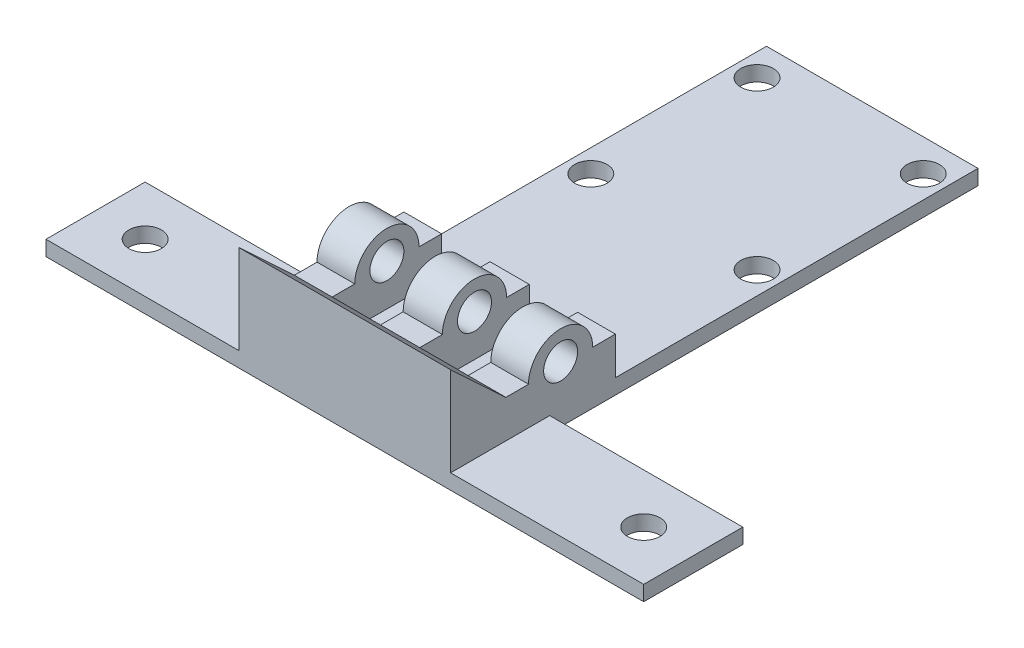
ISO-10303-21;
HEADER;
FILE_DESCRIPTION(('STEP AP214'),'2;1');
FILE_NAME('part.step','',(''),(''),'','','');
FILE_SCHEMA(('AUTOMOTIVE_DESIGN { 1 0 10303 214 1 1 1 1 }'));
ENDSEC;
DATA;
#1=APPLICATION_CONTEXT('core data for automotive mechanical design processes');
#2=APPLICATION_PROTOCOL_DEFINITION('international standard','automotive_design',2000,#1);
#3=PRODUCT_CONTEXT('',#1,'mechanical');
#4=PRODUCT('Part','Part','',(#3));
#5=PRODUCT_RELATED_PRODUCT_CATEGORY('part','',(#4));
#6=PRODUCT_DEFINITION_FORMATION('','',#4);
#7=PRODUCT_DEFINITION_CONTEXT('part definition',#1,'design');
#8=PRODUCT_DEFINITION('design','',#6,#7);
#9=PRODUCT_DEFINITION_SHAPE('','',#8);
#10=(LENGTH_UNIT() NAMED_UNIT(*) SI_UNIT(.MILLI.,.METRE.));
#11=(NAMED_UNIT(*) PLANE_ANGLE_UNIT() SI_UNIT($,.RADIAN.));
#12=(NAMED_UNIT(*) SI_UNIT($,.STERADIAN.) SOLID_ANGLE_UNIT());
#13=UNCERTAINTY_MEASURE_WITH_UNIT(LENGTH_MEASURE(1.E-05),#10,'distance_accuracy_value','');
#14=(GEOMETRIC_REPRESENTATION_CONTEXT(3) GLOBAL_UNCERTAINTY_ASSIGNED_CONTEXT((#13)) GLOBAL_UNIT_ASSIGNED_CONTEXT((#10,
#11,#12)) REPRESENTATION_CONTEXT('',''));
#15=CARTESIAN_POINT('',(0.,0.,0.));
#16=DIRECTION('',(0.,0.,1.));
#17=DIRECTION('',(1.,0.,0.));
#18=AXIS2_PLACEMENT_3D('',#15,#16,#17);
#19=CARTESIAN_POINT('',(14.,1.5,2.25));
#20=DIRECTION('',(0.,1.,0.));
#21=DIRECTION('',(0.,0.,1.));
#22=AXIS2_PLACEMENT_3D('',#19,#20,#21);
#23=PLANE('',#22);
#24=DIRECTION('',(0.,0.,-1.));
#25=VECTOR('',#24,1.);
#26=CARTESIAN_POINT('',(14.,1.5,-2.25));
#27=LINE('',#26,#25);
#28=CARTESIAN_POINT('',(14.,1.5,1.44408761204637));
#29=VERTEX_POINT('',#28);
#30=CARTESIAN_POINT('',(14.,1.50000000000002,-55.25));
#31=VERTEX_POINT('',#30);
#32=EDGE_CURVE('E448',#29,#31,#27,.T.);
#33=ORIENTED_EDGE('',*,*,#32,.F.);
#34=DIRECTION('',(-1.,0.,0.));
#35=VECTOR('',#34,1.);
#36=CARTESIAN_POINT('',(0.,1.5,1.44408761204637));
#37=LINE('',#36,#35);
#38=CARTESIAN_POINT('',(39.5600000000006,1.5,1.44408761204637));
#39=VERTEX_POINT('',#38);
#40=EDGE_CURVE('E258',#39,#29,#37,.T.);
#41=ORIENTED_EDGE('',*,*,#40,.F.);
#42=DIRECTION('',(0.,0.,-1.));
#43=VECTOR('',#42,1.);
#44=CARTESIAN_POINT('',(39.5600000000006,1.5,0.));
#45=LINE('',#44,#43);
#46=CARTESIAN_POINT('',(39.5600000000006,1.5,14.5635370161917));
#47=VERTEX_POINT('',#46);
#48=EDGE_CURVE('E239',#47,#39,#45,.T.);
#49=ORIENTED_EDGE('',*,*,#48,.F.);
#50=DIRECTION('',(-1.,0.,0.));
#51=VECTOR('',#50,1.);
#52=CARTESIAN_POINT('',(-14.,1.5,14.5635370161917));
#53=LINE('',#52,#51);
#54=CARTESIAN_POINT('',(-39.5599999999995,1.5,14.5635370161917));
#55=VERTEX_POINT('',#54);
#56=EDGE_CURVE('E316',#47,#55,#53,.T.);
#57=ORIENTED_EDGE('',*,*,#56,.T.);
#58=DIRECTION('',(0.,0.,1.));
#59=VECTOR('',#58,1.);
#60=CARTESIAN_POINT('',(-39.5599999999995,1.5,0.));
#61=LINE('',#60,#59);
#62=CARTESIAN_POINT('',(-39.5599999999995,1.5,1.44408761204637));
#63=VERTEX_POINT('',#62);
#64=EDGE_CURVE('E261',#63,#55,#61,.T.);
#65=ORIENTED_EDGE('',*,*,#64,.F.);
#66=DIRECTION('',(1.,0.,0.));
#67=VECTOR('',#66,1.);
#68=CARTESIAN_POINT('',(0.,1.5,1.44408761204637));
#69=LINE('',#68,#67);
#70=CARTESIAN_POINT('',(-14.,1.5,1.44408761204637));
#71=VERTEX_POINT('',#70);
#72=EDGE_CURVE('E248',#63,#71,#69,.T.);
#73=ORIENTED_EDGE('',*,*,#72,.T.);
#74=DIRECTION('',(0.,0.,-1.));
#75=VECTOR('',#74,1.);
#76=CARTESIAN_POINT('',(-14.,1.5,2.25));
#77=LINE('',#76,#75);
#78=CARTESIAN_POINT('',(-14.,1.50000000000002,-55.25));
#79=VERTEX_POINT('',#78);
#80=EDGE_CURVE('E451',#71,#79,#77,.T.);
#81=ORIENTED_EDGE('',*,*,#80,.T.);
#82=DIRECTION('',(-1.,0.,0.));
#83=VECTOR('',#82,1.);
#84=CARTESIAN_POINT('',(14.,1.50000000000002,-55.25));
#85=LINE('',#84,#83);
#86=EDGE_CURVE('E324',#31,#79,#85,.T.);
#87=ORIENTED_EDGE('',*,*,#86,.F.);
#88=EDGE_LOOP('',(#33,#41,#49,#57,#65,#73,#81,#87));
#89=FACE_BOUND('',#88,.T.);
#90=CARTESIAN_POINT('',(11.,1.49999999999999,-51.));
#91=DIRECTION('',(0.,1.,0.));
#92=DIRECTION('',(0.,0.,1.));
#93=AXIS2_PLACEMENT_3D('',#90,#91,#92);
#94=CIRCLE('',#93,2.15);
#95=CARTESIAN_POINT('',(11.,1.49999999999999,-48.85));
#96=VERTEX_POINT('',#95);
#97=EDGE_CURVE('E313',#96,#96,#94,.T.);
#98=ORIENTED_EDGE('',*,*,#97,.T.);
#99=EDGE_LOOP('',(#98));
#100=FACE_BOUND('',#99,.T.);
#101=CARTESIAN_POINT('',(11.0000000000006,1.49999999999999,-29.));
#102=DIRECTION('',(0.,1.,0.));
#103=DIRECTION('',(0.,0.,1.));
#104=AXIS2_PLACEMENT_3D('',#101,#102,#103);
#105=CIRCLE('',#104,2.15);
#106=CARTESIAN_POINT('',(11.0000000000006,1.49999999999999,-26.85));
#107=VERTEX_POINT('',#106);
#108=EDGE_CURVE('E299',#107,#107,#105,.T.);
#109=ORIENTED_EDGE('',*,*,#108,.T.);
#110=EDGE_LOOP('',(#109));
#111=FACE_BOUND('',#110,.T.);
#112=CARTESIAN_POINT('',(-10.9999999999995,1.49999999999999,-28.9999999999995));
#113=DIRECTION('',(0.,1.,0.));
#114=DIRECTION('',(0.,0.,1.));
#115=AXIS2_PLACEMENT_3D('',#112,#113,#114);
#116=CIRCLE('',#115,2.15);
#117=CARTESIAN_POINT('',(-10.9999999999995,1.49999999999999,-26.8499999999995));
#118=VERTEX_POINT('',#117);
#119=EDGE_CURVE('E305',#118,#118,#116,.T.);
#120=ORIENTED_EDGE('',*,*,#119,.T.);
#121=EDGE_LOOP('',(#120));
#122=FACE_BOUND('',#121,.T.);
#123=CARTESIAN_POINT('',(-10.9999999999999,1.49999999999999,-50.9999999999995));
#124=DIRECTION('',(0.,1.,0.));
#125=DIRECTION('',(0.,0.,1.));
#126=AXIS2_PLACEMENT_3D('',#123,#124,#125);
#127=CIRCLE('',#126,2.15);
#128=CARTESIAN_POINT('',(-10.9999999999999,1.49999999999999,-48.8499999999995));
#129=VERTEX_POINT('',#128);
#130=EDGE_CURVE('E294',#129,#129,#127,.T.);
#131=ORIENTED_EDGE('',*,*,#130,.T.);
#132=EDGE_LOOP('',(#131));
#133=FACE_BOUND('',#132,.T.);
#134=CARTESIAN_POINT('',(33.0000000000006,1.5,8.00408761204637));
#135=DIRECTION('',(0.,1.,0.));
#136=DIRECTION('',(0.,0.,1.));
#137=AXIS2_PLACEMENT_3D('',#134,#135,#136);
#138=CIRCLE('',#137,2.15);
#139=CARTESIAN_POINT('',(33.0000000000006,1.5,10.1540876120464));
#140=VERTEX_POINT('',#139);
#141=EDGE_CURVE('E288',#140,#140,#138,.F.);
#142=ORIENTED_EDGE('',*,*,#141,.F.);
#143=EDGE_LOOP('',(#142));
#144=FACE_BOUND('',#143,.T.);
#145=CARTESIAN_POINT('',(-32.9999999999995,1.5,8.00000000000053));
#146=DIRECTION('',(0.,1.,0.));
#147=DIRECTION('',(0.,0.,1.));
#148=AXIS2_PLACEMENT_3D('',#145,#146,#147);
#149=CIRCLE('',#148,2.15);
#150=CARTESIAN_POINT('',(-32.9999999999995,1.5,10.1500000000005));
#151=VERTEX_POINT('',#150);
#152=EDGE_CURVE('E277',#151,#151,#149,.F.);
#153=ORIENTED_EDGE('',*,*,#152,.F.);
#154=EDGE_LOOP('',(#153));
#155=FACE_BOUND('',#154,.T.);
#156=ADVANCED_FACE('F49',(#89,#100,#111,#122,#133,#144,#155),#23,.F.);
#157=CARTESIAN_POINT('',(-44.,3.50000000000001,-7.25));
#158=DIRECTION('',(0.,-1.,0.));
#159=DIRECTION('',(0.,0.,-1.));
#160=AXIS2_PLACEMENT_3D('',#157,#158,#159);
#161=PLANE('',#160);
#162=CARTESIAN_POINT('',(-32.9999999999995,3.5,8.00000000000053));
#163=DIRECTION('',(0.,1.,0.));
#164=DIRECTION('',(0.,0.,1.));
#165=AXIS2_PLACEMENT_3D('',#162,#163,#164);
#166=CIRCLE('',#165,2.15);
#167=CARTESIAN_POINT('',(-32.9999999999995,3.5,10.1500000000005));
#168=VERTEX_POINT('',#167);
#169=EDGE_CURVE('E260',#168,#168,#166,.T.);
#170=ORIENTED_EDGE('',*,*,#169,.F.);
#171=EDGE_LOOP('',(#170));
#172=FACE_BOUND('',#171,.T.);
#173=DIRECTION('',(-1.,0.,0.));
#174=VECTOR('',#173,1.);
#175=CARTESIAN_POINT('',(0.,3.50000000000001,1.44408761204637));
#176=LINE('',#175,#174);
#177=CARTESIAN_POINT('',(-14.,3.50000000000001,1.44408761204637));
#178=VERTEX_POINT('',#177);
#179=CARTESIAN_POINT('',(-39.5599999999995,3.50000000000001,1.44408761204637));
#180=VERTEX_POINT('',#179);
#181=EDGE_CURVE('E268',#178,#180,#176,.T.);
#182=ORIENTED_EDGE('',*,*,#181,.T.);
#183=DIRECTION('',(0.,0.,-1.));
#184=VECTOR('',#183,1.);
#185=CARTESIAN_POINT('',(-39.5599999999995,3.50000000000001,0.));
#186=LINE('',#185,#184);
#187=CARTESIAN_POINT('',(-39.5599999999995,3.50000000000001,14.5635370161917));
#188=VERTEX_POINT('',#187);
#189=EDGE_CURVE('E266',#188,#180,#186,.T.);
#190=ORIENTED_EDGE('',*,*,#189,.F.);
#191=DIRECTION('',(1.,0.,0.));
#192=VECTOR('',#191,1.);
#193=CARTESIAN_POINT('',(-44.,3.50000000000001,14.5635370161917));
#194=LINE('',#193,#192);
#195=CARTESIAN_POINT('',(-14.,3.50000000000001,14.5635370161917));
#196=VERTEX_POINT('',#195);
#197=EDGE_CURVE('E283',#188,#196,#194,.T.);
#198=ORIENTED_EDGE('',*,*,#197,.T.);
#199=DIRECTION('',(0.,0.,-1.));
#200=VECTOR('',#199,1.);
#201=CARTESIAN_POINT('',(-14.,3.50000000000001,-7.25));
#202=LINE('',#201,#200);
#203=EDGE_CURVE('E280',#196,#178,#202,.T.);
#204=ORIENTED_EDGE('',*,*,#203,.T.);
#205=EDGE_LOOP('',(#182,#190,#198,#204));
#206=FACE_BOUND('',#205,.T.);
#207=ADVANCED_FACE('F502',(#172,#206),#161,.F.);
#208=CARTESIAN_POINT('',(14.,8.5,0.));
#209=DIRECTION('',(-1.,0.,0.));
#210=DIRECTION('',(0.,0.,1.));
#211=AXIS2_PLACEMENT_3D('',#208,#209,#210);
#212=PLANE('',#211);
#213=CARTESIAN_POINT('',(14.,9.,0.));
#214=DIRECTION('',(1.,0.,0.));
#215=DIRECTION('',(0.,0.,-1.));
#216=AXIS2_PLACEMENT_3D('',#213,#214,#215);
#217=CIRCLE('',#216,2.25);
#218=CARTESIAN_POINT('',(14.,9.,-2.25));
#219=VERTEX_POINT('',#218);
#220=EDGE_CURVE('E442',#219,#219,#217,.T.);
#221=ORIENTED_EDGE('',*,*,#220,.F.);
#222=EDGE_LOOP('',(#221));
#223=FACE_BOUND('',#222,.T.);
#224=DIRECTION('',(0.,0.,1.));
#225=VECTOR('',#224,1.);
#226=CARTESIAN_POINT('',(14.,3.50000000000001,-7.25));
#227=LINE('',#226,#225);
#228=CARTESIAN_POINT('',(14.,3.50000000000001,1.44408761204637));
#229=VERTEX_POINT('',#228);
#230=CARTESIAN_POINT('',(14.,3.50000000000001,14.5635370161917));
#231=VERTEX_POINT('',#230);
#232=EDGE_CURVE('E291',#229,#231,#227,.T.);
#233=ORIENTED_EDGE('',*,*,#232,.F.);
#234=DIRECTION('',(0.,1.,0.));
#235=VECTOR('',#234,1.);
#236=CARTESIAN_POINT('',(14.,-35.5921878184176,1.44408761204637));
#237=LINE('',#236,#235);
#238=EDGE_CURVE('E67',#29,#229,#237,.T.);
#239=ORIENTED_EDGE('',*,*,#238,.F.);
#240=ORIENTED_EDGE('',*,*,#32,.T.);
#241=DIRECTION('',(0.,-1.,0.));
#242=VECTOR('',#241,1.);
#243=CARTESIAN_POINT('',(14.,1.50000000000002,-55.25));
#244=LINE('',#243,#242);
#245=CARTESIAN_POINT('',(14.,3.50000000000003,-55.25));
#246=VERTEX_POINT('',#245);
#247=EDGE_CURVE('E321',#246,#31,#244,.T.);
#248=ORIENTED_EDGE('',*,*,#247,.F.);
#249=DIRECTION('',(0.,0.,1.));
#250=VECTOR('',#249,1.);
#251=CARTESIAN_POINT('',(14.,3.50000000000003,-55.25));
#252=LINE('',#251,#250);
#253=CARTESIAN_POINT('',(14.,3.50000000000001,-7.25));
#254=VERTEX_POINT('',#253);
#255=EDGE_CURVE('E330',#246,#254,#252,.T.);
#256=ORIENTED_EDGE('',*,*,#255,.T.);
#257=DIRECTION('',(0.,1.,0.));
#258=VECTOR('',#257,1.);
#259=CARTESIAN_POINT('',(14.,1.5,-7.25));
#260=LINE('',#259,#258);
#261=CARTESIAN_POINT('',(14.,8.5,-7.25));
#262=VERTEX_POINT('',#261);
#263=EDGE_CURVE('E450',#254,#262,#260,.T.);
#264=ORIENTED_EDGE('',*,*,#263,.T.);
#265=DIRECTION('',(0.,0.,1.));
#266=VECTOR('',#265,1.);
#267=CARTESIAN_POINT('',(14.,8.5,-7.25));
#268=LINE('',#267,#266);
#269=CARTESIAN_POINT('',(14.,8.5,-4.25));
#270=VERTEX_POINT('',#269);
#271=EDGE_CURVE('E453',#262,#270,#268,.T.);
#272=ORIENTED_EDGE('',*,*,#271,.T.);
#273=CARTESIAN_POINT('',(14.,8.5,0.));
#274=DIRECTION('',(1.,0.,0.));
#275=DIRECTION('',(0.,0.,1.));
#276=AXIS2_PLACEMENT_3D('',#273,#274,#275);
#277=CIRCLE('',#276,4.25);
#278=CARTESIAN_POINT('',(14.,8.5,4.25));
#279=VERTEX_POINT('',#278);
#280=EDGE_CURVE('E455',#270,#279,#277,.T.);
#281=ORIENTED_EDGE('',*,*,#280,.T.);
#282=DIRECTION('',(0.,0.,1.));
#283=VECTOR('',#282,1.);
#284=CARTESIAN_POINT('',(14.,8.5,7.25));
#285=LINE('',#284,#283);
#286=CARTESIAN_POINT('',(14.,8.5,7.25));
#287=VERTEX_POINT('',#286);
#288=EDGE_CURVE('E457',#279,#287,#285,.T.);
#289=ORIENTED_EDGE('',*,*,#288,.T.);
#290=DIRECTION('',(0.,-0.681998360062502,-0.731353701619167));
#291=VECTOR('',#290,1.);
#292=CARTESIAN_POINT('',(14.,8.5,7.25));
#293=LINE('',#292,#291);
#294=CARTESIAN_POINT('',(14.,15.319983600625,14.5635370161917));
#295=VERTEX_POINT('',#294);
#296=EDGE_CURVE('E340',#295,#287,#293,.T.);
#297=ORIENTED_EDGE('',*,*,#296,.F.);
#298=DIRECTION('',(0.,1.,0.));
#299=VECTOR('',#298,1.);
#300=CARTESIAN_POINT('',(14.,8.31998360062493,14.5635370161917));
#301=LINE('',#300,#299);
#302=EDGE_CURVE('E338',#231,#295,#301,.T.);
#303=ORIENTED_EDGE('',*,*,#302,.F.);
#304=EDGE_LOOP('',(#233,#239,#240,#248,#256,#264,#272,#281,#289,#297,#303));
#305=FACE_BOUND('',#304,.T.);
#306=ADVANCED_FACE('F499',(#223,#305),#212,.F.);
#307=CARTESIAN_POINT('',(14.,1.5,-7.25));
#308=DIRECTION('',(0.,0.,1.));
#309=DIRECTION('',(0.,-1.,0.));
#310=AXIS2_PLACEMENT_3D('',#307,#308,#309);
#311=PLANE('',#310);
#312=DIRECTION('',(1.,0.,0.));
#313=VECTOR('',#312,1.);
#314=CARTESIAN_POINT('',(14.,3.50000000000001,-7.25));
#315=LINE('',#314,#313);
#316=CARTESIAN_POINT('',(-14.,3.50000000000001,-7.25));
#317=VERTEX_POINT('',#316);
#318=CARTESIAN_POINT('',(-9.,3.5,-7.25));
#319=VERTEX_POINT('',#318);
#320=EDGE_CURVE('E60',#317,#319,#315,.T.);
#321=ORIENTED_EDGE('',*,*,#320,.F.);
#322=DIRECTION('',(0.,1.,0.));
#323=VECTOR('',#322,1.);
#324=CARTESIAN_POINT('',(-14.,1.5,-7.25));
#325=LINE('',#324,#323);
#326=CARTESIAN_POINT('',(-14.,8.5,-7.25));
#327=VERTEX_POINT('',#326);
#328=EDGE_CURVE('E445',#317,#327,#325,.T.);
#329=ORIENTED_EDGE('',*,*,#328,.T.);
#330=DIRECTION('',(-1.,0.,0.));
#331=VECTOR('',#330,1.);
#332=CARTESIAN_POINT('',(14.,8.5,-7.25));
#333=LINE('',#332,#331);
#334=CARTESIAN_POINT('',(-9.,8.5,-7.25));
#335=VERTEX_POINT('',#334);
#336=EDGE_CURVE('E481',#335,#327,#333,.T.);
#337=ORIENTED_EDGE('',*,*,#336,.F.);
#338=DIRECTION('',(0.,-1.,0.));
#339=VECTOR('',#338,1.);
#340=CARTESIAN_POINT('',(-9.,12.75,-7.25));
#341=LINE('',#340,#339);
#342=EDGE_CURVE('E405',#335,#319,#341,.T.);
#343=ORIENTED_EDGE('',*,*,#342,.T.);
#344=EDGE_LOOP('',(#321,#329,#337,#343));
#345=FACE_BOUND('',#344,.T.);
#346=ADVANCED_FACE('F51',(#345),#311,.F.);
#347=CARTESIAN_POINT('',(-2.6,3.5,-7.25));
#348=VERTEX_POINT('',#347);
#349=CARTESIAN_POINT('',(2.6,3.5,-7.25));
#350=VERTEX_POINT('',#349);
#351=EDGE_CURVE('E13',#348,#350,#315,.T.);
#352=ORIENTED_EDGE('',*,*,#351,.F.);
#353=DIRECTION('',(0.,1.,0.));
#354=VECTOR('',#353,1.);
#355=CARTESIAN_POINT('',(-2.6,3.5,-7.25));
#356=LINE('',#355,#354);
#357=CARTESIAN_POINT('',(-2.6,8.5,-7.25));
#358=VERTEX_POINT('',#357);
#359=EDGE_CURVE('E368',#348,#358,#356,.T.);
#360=ORIENTED_EDGE('',*,*,#359,.T.);
#361=DIRECTION('',(-1.,0.,0.));
#362=VECTOR('',#361,1.);
#363=CARTESIAN_POINT('',(26.1992005628169,8.5,-7.25));
#364=LINE('',#363,#362);
#365=CARTESIAN_POINT('',(2.6,8.5,-7.25));
#366=VERTEX_POINT('',#365);
#367=EDGE_CURVE('E395',#366,#358,#364,.T.);
#368=ORIENTED_EDGE('',*,*,#367,.F.);
#369=DIRECTION('',(0.,1.,0.));
#370=VECTOR('',#369,1.);
#371=CARTESIAN_POINT('',(2.6,3.5,-7.25));
#372=LINE('',#371,#370);
#373=EDGE_CURVE('E379',#350,#366,#372,.T.);
#374=ORIENTED_EDGE('',*,*,#373,.F.);
#375=EDGE_LOOP('',(#352,#360,#368,#374));
#376=FACE_BOUND('',#375,.T.);
#377=ADVANCED_FACE('F572',(#376),#311,.F.);
#378=CARTESIAN_POINT('',(9.,3.5,-7.25));
#379=VERTEX_POINT('',#378);
#380=EDGE_CURVE('E58',#379,#254,#315,.T.);
#381=ORIENTED_EDGE('',*,*,#380,.F.);
#382=DIRECTION('',(0.,1.,0.));
#383=VECTOR('',#382,1.);
#384=CARTESIAN_POINT('',(9.,12.75,-7.25));
#385=LINE('',#384,#383);
#386=CARTESIAN_POINT('',(9.,8.5,-7.25));
#387=VERTEX_POINT('',#386);
#388=EDGE_CURVE('E408',#379,#387,#385,.T.);
#389=ORIENTED_EDGE('',*,*,#388,.T.);
#390=EDGE_CURVE('E482',#262,#387,#333,.T.);
#391=ORIENTED_EDGE('',*,*,#390,.F.);
#392=ORIENTED_EDGE('',*,*,#263,.F.);
#393=EDGE_LOOP('',(#381,#389,#391,#392));
#394=FACE_BOUND('',#393,.T.);
#395=ADVANCED_FACE('F545',(#394),#311,.F.);
#396=CARTESIAN_POINT('',(14.,8.5,-7.25));
#397=DIRECTION('',(0.,-1.,0.));
#398=DIRECTION('',(0.,0.,-1.));
#399=AXIS2_PLACEMENT_3D('',#396,#397,#398);
#400=PLANE('',#399);
#401=DIRECTION('',(-1.,0.,0.));
#402=VECTOR('',#401,1.);
#403=CARTESIAN_POINT('',(14.,8.5,-4.25));
#404=LINE('',#403,#402);
#405=CARTESIAN_POINT('',(-9.,8.5,-4.25));
#406=VERTEX_POINT('',#405);
#407=CARTESIAN_POINT('',(-14.,8.5,-4.25));
#408=VERTEX_POINT('',#407);
#409=EDGE_CURVE('E477',#406,#408,#404,.T.);
#410=ORIENTED_EDGE('',*,*,#409,.F.);
#411=DIRECTION('',(0.,0.,-1.));
#412=VECTOR('',#411,1.);
#413=CARTESIAN_POINT('',(-9.,8.5,-7.25));
#414=LINE('',#413,#412);
#415=EDGE_CURVE('E438',#406,#335,#414,.T.);
#416=ORIENTED_EDGE('',*,*,#415,.T.);
#417=ORIENTED_EDGE('',*,*,#336,.T.);
#418=DIRECTION('',(0.,0.,1.));
#419=VECTOR('',#418,1.);
#420=CARTESIAN_POINT('',(-14.,8.5,-7.25));
#421=LINE('',#420,#419);
#422=EDGE_CURVE('E461',#327,#408,#421,.T.);
#423=ORIENTED_EDGE('',*,*,#422,.T.);
#424=EDGE_LOOP('',(#410,#416,#417,#423));
#425=FACE_BOUND('',#424,.T.);
#426=ADVANCED_FACE('F605',(#425),#400,.F.);
#427=CARTESIAN_POINT('',(14.,8.5,0.));
#428=DIRECTION('',(-1.,0.,0.));
#429=DIRECTION('',(0.,0.,1.));
#430=AXIS2_PLACEMENT_3D('',#427,#428,#429);
#431=CYLINDRICAL_SURFACE('',#430,4.25);
#432=DIRECTION('',(-1.,0.,0.));
#433=VECTOR('',#432,1.);
#434=CARTESIAN_POINT('',(14.,8.5,4.25));
#435=LINE('',#434,#433);
#436=CARTESIAN_POINT('',(-9.,8.5,4.25));
#437=VERTEX_POINT('',#436);
#438=CARTESIAN_POINT('',(-14.,8.5,4.25));
#439=VERTEX_POINT('',#438);
#440=EDGE_CURVE('E473',#437,#439,#435,.T.);
#441=ORIENTED_EDGE('',*,*,#440,.F.);
#442=CARTESIAN_POINT('',(-9.,8.5,0.));
#443=DIRECTION('',(-1.,0.,0.));
#444=DIRECTION('',(0.,0.,1.));
#445=AXIS2_PLACEMENT_3D('',#442,#443,#444);
#446=CIRCLE('',#445,4.25);
#447=EDGE_CURVE('E435',#437,#406,#446,.T.);
#448=ORIENTED_EDGE('',*,*,#447,.T.);
#449=ORIENTED_EDGE('',*,*,#409,.T.);
#450=CARTESIAN_POINT('',(-14.,8.5,0.));
#451=DIRECTION('',(1.,0.,0.));
#452=DIRECTION('',(0.,0.,1.));
#453=AXIS2_PLACEMENT_3D('',#450,#451,#452);
#454=CIRCLE('',#453,4.25);
#455=EDGE_CURVE('E464',#408,#439,#454,.T.);
#456=ORIENTED_EDGE('',*,*,#455,.T.);
#457=EDGE_LOOP('',(#441,#448,#449,#456));
#458=FACE_BOUND('',#457,.T.);
#459=ADVANCED_FACE('F598',(#458),#431,.T.);
#460=CARTESIAN_POINT('',(14.,8.5,7.25));
#461=DIRECTION('',(0.,-1.,0.));
#462=DIRECTION('',(0.,0.,-1.));
#463=AXIS2_PLACEMENT_3D('',#460,#461,#462);
#464=PLANE('',#463);
#465=DIRECTION('',(-1.,0.,0.));
#466=VECTOR('',#465,1.);
#467=CARTESIAN_POINT('',(14.,8.5,7.25));
#468=LINE('',#467,#466);
#469=CARTESIAN_POINT('',(-9.,8.5,7.25));
#470=VERTEX_POINT('',#469);
#471=CARTESIAN_POINT('',(-14.,8.5,7.25));
#472=VERTEX_POINT('',#471);
#473=EDGE_CURVE('E459',#470,#472,#468,.T.);
#474=ORIENTED_EDGE('',*,*,#473,.F.);
#475=DIRECTION('',(0.,0.,-1.));
#476=VECTOR('',#475,1.);
#477=CARTESIAN_POINT('',(-9.,8.5,7.25));
#478=LINE('',#477,#476);
#479=EDGE_CURVE('E432',#470,#437,#478,.T.);
#480=ORIENTED_EDGE('',*,*,#479,.T.);
#481=ORIENTED_EDGE('',*,*,#440,.T.);
#482=DIRECTION('',(0.,0.,1.));
#483=VECTOR('',#482,1.);
#484=CARTESIAN_POINT('',(-14.,8.5,7.25));
#485=LINE('',#484,#483);
#486=EDGE_CURVE('E467',#439,#472,#485,.T.);
#487=ORIENTED_EDGE('',*,*,#486,.T.);
#488=EDGE_LOOP('',(#474,#480,#481,#487));
#489=FACE_BOUND('',#488,.T.);
#490=ADVANCED_FACE('F596',(#489),#464,.F.);
#491=CARTESIAN_POINT('',(14.,9.,0.));
#492=DIRECTION('',(-1.,0.,0.));
#493=DIRECTION('',(0.,0.,1.));
#494=AXIS2_PLACEMENT_3D('',#491,#492,#493);
#495=CYLINDRICAL_SURFACE('',#494,2.25);
#496=CARTESIAN_POINT('',(-9.,9.,0.));
#497=DIRECTION('',(-1.,0.,0.));
#498=DIRECTION('',(0.,0.,1.));
#499=AXIS2_PLACEMENT_3D('',#496,#497,#498);
#500=CIRCLE('',#499,2.25);
#501=CARTESIAN_POINT('',(-9.,9.,2.25));
#502=VERTEX_POINT('',#501);
#503=EDGE_CURVE('E53',#502,#502,#500,.T.);
#504=ORIENTED_EDGE('',*,*,#503,.F.);
#505=EDGE_LOOP('',(#504));
#506=FACE_BOUND('',#505,.T.);
#507=CARTESIAN_POINT('',(-14.,9.,0.));
#508=DIRECTION('',(1.,0.,0.));
#509=DIRECTION('',(0.,0.,-1.));
#510=AXIS2_PLACEMENT_3D('',#507,#508,#509);
#511=CIRCLE('',#510,2.25);
#512=CARTESIAN_POINT('',(-14.,9.,-2.25));
#513=VERTEX_POINT('',#512);
#514=EDGE_CURVE('E441',#513,#513,#511,.T.);
#515=ORIENTED_EDGE('',*,*,#514,.F.);
#516=EDGE_LOOP('',(#515));
#517=FACE_BOUND('',#516,.T.);
#518=ADVANCED_FACE('F496',(#506,#517),#495,.F.);
#519=CARTESIAN_POINT('',(-14.,8.5,0.));
#520=DIRECTION('',(-1.,0.,0.));
#521=DIRECTION('',(0.,0.,1.));
#522=AXIS2_PLACEMENT_3D('',#519,#520,#521);
#523=PLANE('',#522);
#524=ORIENTED_EDGE('',*,*,#203,.F.);
#525=DIRECTION('',(0.,1.,0.));
#526=VECTOR('',#525,1.);
#527=CARTESIAN_POINT('',(-14.,8.31998360062493,14.5635370161917));
#528=LINE('',#527,#526);
#529=CARTESIAN_POINT('',(-14.,15.319983600625,14.5635370161917));
#530=VERTEX_POINT('',#529);
#531=EDGE_CURVE('E337',#196,#530,#528,.T.);
#532=ORIENTED_EDGE('',*,*,#531,.T.);
#533=DIRECTION('',(0.,-0.681998360062502,-0.731353701619167));
#534=VECTOR('',#533,1.);
#535=CARTESIAN_POINT('',(-14.,8.5,7.25));
#536=LINE('',#535,#534);
#537=EDGE_CURVE('E341',#530,#472,#536,.T.);
#538=ORIENTED_EDGE('',*,*,#537,.T.);
#539=ORIENTED_EDGE('',*,*,#486,.F.);
#540=ORIENTED_EDGE('',*,*,#455,.F.);
#541=ORIENTED_EDGE('',*,*,#422,.F.);
#542=ORIENTED_EDGE('',*,*,#328,.F.);
#543=DIRECTION('',(0.,0.,1.));
#544=VECTOR('',#543,1.);
#545=CARTESIAN_POINT('',(-14.,3.50000000000003,-55.25));
#546=LINE('',#545,#544);
#547=CARTESIAN_POINT('',(-14.,3.50000000000003,-55.25));
#548=VERTEX_POINT('',#547);
#549=EDGE_CURVE('E335',#548,#317,#546,.T.);
#550=ORIENTED_EDGE('',*,*,#549,.F.);
#551=DIRECTION('',(0.,1.,0.));
#552=VECTOR('',#551,1.);
#553=CARTESIAN_POINT('',(-14.,1.50000000000002,-55.25));
#554=LINE('',#553,#552);
#555=EDGE_CURVE('E327',#79,#548,#554,.T.);
#556=ORIENTED_EDGE('',*,*,#555,.F.);
#557=ORIENTED_EDGE('',*,*,#80,.F.);
#558=DIRECTION('',(0.,1.,0.));
#559=VECTOR('',#558,1.);
#560=CARTESIAN_POINT('',(-14.,-35.5921878184176,1.44408761204637));
#561=LINE('',#560,#559);
#562=EDGE_CURVE('E263',#71,#178,#561,.T.);
#563=ORIENTED_EDGE('',*,*,#562,.T.);
#564=EDGE_LOOP('',(#524,#532,#538,#539,#540,#541,#542,#550,#556,#557,#563));
#565=FACE_BOUND('',#564,.T.);
#566=ORIENTED_EDGE('',*,*,#514,.T.);
#567=EDGE_LOOP('',(#566));
#568=FACE_BOUND('',#567,.T.);
#569=ADVANCED_FACE('F518',(#565,#568),#523,.T.);
#570=ORIENTED_EDGE('',*,*,#390,.T.);
#571=DIRECTION('',(0.,0.,1.));
#572=VECTOR('',#571,1.);
#573=CARTESIAN_POINT('',(9.,8.5,-7.25));
#574=LINE('',#573,#572);
#575=CARTESIAN_POINT('',(9.,8.5,-4.25));
#576=VERTEX_POINT('',#575);
#577=EDGE_CURVE('E429',#387,#576,#574,.T.);
#578=ORIENTED_EDGE('',*,*,#577,.T.);
#579=EDGE_CURVE('E478',#270,#576,#404,.T.);
#580=ORIENTED_EDGE('',*,*,#579,.F.);
#581=ORIENTED_EDGE('',*,*,#271,.F.);
#582=EDGE_LOOP('',(#570,#578,#580,#581));
#583=FACE_BOUND('',#582,.T.);
#584=ADVANCED_FACE('F552',(#583),#400,.F.);
#585=CARTESIAN_POINT('',(9.,8.5,0.));
#586=DIRECTION('',(1.,0.,0.));
#587=DIRECTION('',(0.,0.,-1.));
#588=AXIS2_PLACEMENT_3D('',#585,#586,#587);
#589=CIRCLE('',#588,4.25);
#590=CARTESIAN_POINT('',(9.,8.5,4.25));
#591=VERTEX_POINT('',#590);
#592=EDGE_CURVE('E427',#576,#591,#589,.T.);
#593=ORIENTED_EDGE('',*,*,#592,.T.);
#594=EDGE_CURVE('E474',#279,#591,#435,.T.);
#595=ORIENTED_EDGE('',*,*,#594,.F.);
#596=ORIENTED_EDGE('',*,*,#280,.F.);
#597=ORIENTED_EDGE('',*,*,#579,.T.);
#598=EDGE_LOOP('',(#593,#595,#596,#597));
#599=FACE_BOUND('',#598,.T.);
#600=ADVANCED_FACE('F554',(#599),#431,.T.);
#601=ORIENTED_EDGE('',*,*,#594,.T.);
#602=DIRECTION('',(0.,0.,1.));
#603=VECTOR('',#602,1.);
#604=CARTESIAN_POINT('',(9.,8.5,7.25));
#605=LINE('',#604,#603);
#606=CARTESIAN_POINT('',(9.,8.5,7.25));
#607=VERTEX_POINT('',#606);
#608=EDGE_CURVE('E424',#591,#607,#605,.T.);
#609=ORIENTED_EDGE('',*,*,#608,.T.);
#610=EDGE_CURVE('E470',#287,#607,#468,.T.);
#611=ORIENTED_EDGE('',*,*,#610,.F.);
#612=ORIENTED_EDGE('',*,*,#288,.F.);
#613=EDGE_LOOP('',(#601,#609,#611,#612));
#614=FACE_BOUND('',#613,.T.);
#615=ADVANCED_FACE('F494',(#614),#464,.F.);
#616=CARTESIAN_POINT('',(9.,9.,0.));
#617=DIRECTION('',(1.,0.,0.));
#618=DIRECTION('',(0.,0.,-1.));
#619=AXIS2_PLACEMENT_3D('',#616,#617,#618);
#620=CIRCLE('',#619,2.25);
#621=CARTESIAN_POINT('',(9.,9.,-2.25));
#622=VERTEX_POINT('',#621);
#623=EDGE_CURVE('E422',#622,#622,#620,.T.);
#624=ORIENTED_EDGE('',*,*,#623,.F.);
#625=EDGE_LOOP('',(#624));
#626=FACE_BOUND('',#625,.T.);
#627=ORIENTED_EDGE('',*,*,#220,.T.);
#628=EDGE_LOOP('',(#627));
#629=FACE_BOUND('',#628,.T.);
#630=ADVANCED_FACE('F490',(#626,#629),#495,.F.);
#631=CARTESIAN_POINT('',(-9.,12.75,-7.25));
#632=DIRECTION('',(-1.,0.,0.));
#633=DIRECTION('',(0.,0.,1.));
#634=AXIS2_PLACEMENT_3D('',#631,#632,#633);
#635=PLANE('',#634);
#636=ORIENTED_EDGE('',*,*,#503,.T.);
#637=EDGE_LOOP('',(#636));
#638=FACE_BOUND('',#637,.T.);
#639=ORIENTED_EDGE('',*,*,#447,.F.);
#640=ORIENTED_EDGE('',*,*,#479,.F.);
#641=DIRECTION('',(0.,-1.,0.));
#642=VECTOR('',#641,1.);
#643=CARTESIAN_POINT('',(-9.,12.75,7.25));
#644=LINE('',#643,#642);
#645=CARTESIAN_POINT('',(-9.,3.5,7.25));
#646=VERTEX_POINT('',#645);
#647=EDGE_CURVE('E402',#470,#646,#644,.T.);
#648=ORIENTED_EDGE('',*,*,#647,.T.);
#649=DIRECTION('',(0.,0.,1.));
#650=VECTOR('',#649,1.);
#651=CARTESIAN_POINT('',(-9.,3.5,-7.25));
#652=LINE('',#651,#650);
#653=EDGE_CURVE('E412',#319,#646,#652,.T.);
#654=ORIENTED_EDGE('',*,*,#653,.F.);
#655=ORIENTED_EDGE('',*,*,#342,.F.);
#656=ORIENTED_EDGE('',*,*,#415,.F.);
#657=EDGE_LOOP('',(#639,#640,#648,#654,#655,#656));
#658=FACE_BOUND('',#657,.T.);
#659=ADVANCED_FACE('F493',(#638,#658),#635,.F.);
#660=CARTESIAN_POINT('',(9.,12.75,-7.25));
#661=DIRECTION('',(1.,0.,0.));
#662=DIRECTION('',(0.,0.,-1.));
#663=AXIS2_PLACEMENT_3D('',#660,#661,#662);
#664=PLANE('',#663);
#665=ORIENTED_EDGE('',*,*,#623,.T.);
#666=EDGE_LOOP('',(#665));
#667=FACE_BOUND('',#666,.T.);
#668=ORIENTED_EDGE('',*,*,#388,.F.);
#669=DIRECTION('',(0.,0.,1.));
#670=VECTOR('',#669,1.);
#671=CARTESIAN_POINT('',(9.,3.5,-7.25));
#672=LINE('',#671,#670);
#673=CARTESIAN_POINT('',(9.,3.5,7.25));
#674=VERTEX_POINT('',#673);
#675=EDGE_CURVE('E419',#379,#674,#672,.T.);
#676=ORIENTED_EDGE('',*,*,#675,.T.);
#677=DIRECTION('',(0.,1.,0.));
#678=VECTOR('',#677,1.);
#679=CARTESIAN_POINT('',(9.,12.75,7.25));
#680=LINE('',#679,#678);
#681=EDGE_CURVE('E409',#674,#607,#680,.T.);
#682=ORIENTED_EDGE('',*,*,#681,.T.);
#683=ORIENTED_EDGE('',*,*,#608,.F.);
#684=ORIENTED_EDGE('',*,*,#592,.F.);
#685=ORIENTED_EDGE('',*,*,#577,.F.);
#686=EDGE_LOOP('',(#668,#676,#682,#683,#684,#685));
#687=FACE_BOUND('',#686,.T.);
#688=ADVANCED_FACE('F487',(#667,#687),#664,.F.);
#689=CARTESIAN_POINT('',(-9.,3.5,-7.25));
#690=DIRECTION('',(0.,-1.,0.));
#691=DIRECTION('',(0.,0.,-1.));
#692=AXIS2_PLACEMENT_3D('',#689,#690,#691);
#693=PLANE('',#692);
#694=CARTESIAN_POINT('',(-10.9999999999999,3.5,-50.9999999999995));
#695=DIRECTION('',(0.,1.,0.));
#696=DIRECTION('',(0.,0.,1.));
#697=AXIS2_PLACEMENT_3D('',#694,#695,#696);
#698=CIRCLE('',#697,2.15);
#699=CARTESIAN_POINT('',(-10.9999999999999,3.5,-48.8499999999995));
#700=VERTEX_POINT('',#699);
#701=EDGE_CURVE('E308',#700,#700,#698,.T.);
#702=ORIENTED_EDGE('',*,*,#701,.F.);
#703=EDGE_LOOP('',(#702));
#704=FACE_BOUND('',#703,.T.);
#705=CARTESIAN_POINT('',(-10.9999999999995,3.5,-28.9999999999995));
#706=DIRECTION('',(0.,1.,0.));
#707=DIRECTION('',(0.,0.,1.));
#708=AXIS2_PLACEMENT_3D('',#705,#706,#707);
#709=CIRCLE('',#708,2.15);
#710=CARTESIAN_POINT('',(-10.9999999999995,3.5,-26.8499999999995));
#711=VERTEX_POINT('',#710);
#712=EDGE_CURVE('E302',#711,#711,#709,.T.);
#713=ORIENTED_EDGE('',*,*,#712,.F.);
#714=EDGE_LOOP('',(#713));
#715=FACE_BOUND('',#714,.T.);
#716=CARTESIAN_POINT('',(11.0000000000006,3.5,-29.));
#717=DIRECTION('',(0.,1.,0.));
#718=DIRECTION('',(0.,0.,1.));
#719=AXIS2_PLACEMENT_3D('',#716,#717,#718);
#720=CIRCLE('',#719,2.15);
#721=CARTESIAN_POINT('',(11.0000000000006,3.5,-26.85));
#722=VERTEX_POINT('',#721);
#723=EDGE_CURVE('E295',#722,#722,#720,.T.);
#724=ORIENTED_EDGE('',*,*,#723,.F.);
#725=EDGE_LOOP('',(#724));
#726=FACE_BOUND('',#725,.T.);
#727=CARTESIAN_POINT('',(11.,3.5,-51.));
#728=DIRECTION('',(0.,1.,0.));
#729=DIRECTION('',(0.,0.,1.));
#730=AXIS2_PLACEMENT_3D('',#727,#728,#729);
#731=CIRCLE('',#730,2.15);
#732=CARTESIAN_POINT('',(11.,3.5,-48.85));
#733=VERTEX_POINT('',#732);
#734=EDGE_CURVE('E298',#733,#733,#731,.T.);
#735=ORIENTED_EDGE('',*,*,#734,.F.);
#736=EDGE_LOOP('',(#735));
#737=FACE_BOUND('',#736,.T.);
#738=DIRECTION('',(1.,0.,0.));
#739=VECTOR('',#738,1.);
#740=CARTESIAN_POINT('',(-9.,3.5,7.25));
#741=LINE('',#740,#739);
#742=CARTESIAN_POINT('',(-2.6,3.5,7.25));
#743=VERTEX_POINT('',#742);
#744=EDGE_CURVE('E416',#646,#743,#741,.T.);
#745=ORIENTED_EDGE('',*,*,#744,.T.);
#746=DIRECTION('',(0.,0.,-1.));
#747=VECTOR('',#746,1.);
#748=CARTESIAN_POINT('',(-2.6,3.5,7.25));
#749=LINE('',#748,#747);
#750=EDGE_CURVE('E371',#743,#348,#749,.T.);
#751=ORIENTED_EDGE('',*,*,#750,.T.);
#752=ORIENTED_EDGE('',*,*,#351,.T.);
#753=DIRECTION('',(0.,0.,-1.));
#754=VECTOR('',#753,1.);
#755=CARTESIAN_POINT('',(2.6,3.5,7.25));
#756=LINE('',#755,#754);
#757=CARTESIAN_POINT('',(2.6,3.5,7.25));
#758=VERTEX_POINT('',#757);
#759=EDGE_CURVE('E382',#758,#350,#756,.T.);
#760=ORIENTED_EDGE('',*,*,#759,.F.);
#761=EDGE_CURVE('E415',#758,#674,#741,.T.);
#762=ORIENTED_EDGE('',*,*,#761,.T.);
#763=ORIENTED_EDGE('',*,*,#675,.F.);
#764=ORIENTED_EDGE('',*,*,#380,.T.);
#765=ORIENTED_EDGE('',*,*,#255,.F.);
#766=DIRECTION('',(1.,0.,0.));
#767=VECTOR('',#766,1.);
#768=CARTESIAN_POINT('',(14.,3.50000000000003,-55.25));
#769=LINE('',#768,#767);
#770=EDGE_CURVE('E329',#548,#246,#769,.T.);
#771=ORIENTED_EDGE('',*,*,#770,.F.);
#772=ORIENTED_EDGE('',*,*,#549,.T.);
#773=ORIENTED_EDGE('',*,*,#320,.T.);
#774=ORIENTED_EDGE('',*,*,#653,.T.);
#775=EDGE_LOOP('',(#745,#751,#752,#760,#762,#763,#764,#765,#771,#772,#773,#774));
#776=FACE_BOUND('',#775,.T.);
#777=ADVANCED_FACE('F541',(#704,#715,#726,#737,#776),#693,.F.);
#778=CARTESIAN_POINT('',(26.1992005628169,8.5,-7.25));
#779=DIRECTION('',(0.,-1.,0.));
#780=DIRECTION('',(0.,0.,-1.));
#781=AXIS2_PLACEMENT_3D('',#778,#779,#780);
#782=PLANE('',#781);
#783=DIRECTION('',(0.,0.,1.));
#784=VECTOR('',#783,1.);
#785=CARTESIAN_POINT('',(2.6,8.5,-7.25));
#786=LINE('',#785,#784);
#787=CARTESIAN_POINT('',(2.6,8.5,-4.25));
#788=VERTEX_POINT('',#787);
#789=EDGE_CURVE('E376',#366,#788,#786,.T.);
#790=ORIENTED_EDGE('',*,*,#789,.F.);
#791=ORIENTED_EDGE('',*,*,#367,.T.);
#792=DIRECTION('',(0.,0.,1.));
#793=VECTOR('',#792,1.);
#794=CARTESIAN_POINT('',(-2.6,8.5,-7.25));
#795=LINE('',#794,#793);
#796=CARTESIAN_POINT('',(-2.6,8.5,-4.25));
#797=VERTEX_POINT('',#796);
#798=EDGE_CURVE('E365',#358,#797,#795,.T.);
#799=ORIENTED_EDGE('',*,*,#798,.T.);
#800=DIRECTION('',(-1.,0.,0.));
#801=VECTOR('',#800,1.);
#802=CARTESIAN_POINT('',(26.1992005628169,8.5,-4.25));
#803=LINE('',#802,#801);
#804=EDGE_CURVE('E393',#788,#797,#803,.T.);
#805=ORIENTED_EDGE('',*,*,#804,.F.);
#806=EDGE_LOOP('',(#790,#791,#799,#805));
#807=FACE_BOUND('',#806,.T.);
#808=ADVANCED_FACE('F581',(#807),#782,.F.);
#809=CARTESIAN_POINT('',(26.1992005628169,8.5,4.25));
#810=DIRECTION('',(0.,-1.,0.));
#811=DIRECTION('',(0.,0.,-1.));
#812=AXIS2_PLACEMENT_3D('',#809,#810,#811);
#813=PLANE('',#812);
#814=DIRECTION('',(0.,0.,1.));
#815=VECTOR('',#814,1.);
#816=CARTESIAN_POINT('',(2.6,8.5,4.25));
#817=LINE('',#816,#815);
#818=CARTESIAN_POINT('',(2.6,8.5,4.25));
#819=VERTEX_POINT('',#818);
#820=CARTESIAN_POINT('',(2.6,8.5,7.25));
#821=VERTEX_POINT('',#820);
#822=EDGE_CURVE('E387',#819,#821,#817,.T.);
#823=ORIENTED_EDGE('',*,*,#822,.F.);
#824=DIRECTION('',(-1.,0.,0.));
#825=VECTOR('',#824,1.);
#826=CARTESIAN_POINT('',(26.1992005628169,8.5,4.25));
#827=LINE('',#826,#825);
#828=CARTESIAN_POINT('',(-2.6,8.5,4.25));
#829=VERTEX_POINT('',#828);
#830=EDGE_CURVE('E400',#819,#829,#827,.T.);
#831=ORIENTED_EDGE('',*,*,#830,.T.);
#832=DIRECTION('',(0.,0.,1.));
#833=VECTOR('',#832,1.);
#834=CARTESIAN_POINT('',(-2.6,8.5,4.25));
#835=LINE('',#834,#833);
#836=CARTESIAN_POINT('',(-2.6,8.5,7.25));
#837=VERTEX_POINT('',#836);
#838=EDGE_CURVE('E358',#829,#837,#835,.T.);
#839=ORIENTED_EDGE('',*,*,#838,.T.);
#840=DIRECTION('',(-1.,0.,0.));
#841=VECTOR('',#840,1.);
#842=CARTESIAN_POINT('',(26.1992005628169,8.5,7.25));
#843=LINE('',#842,#841);
#844=EDGE_CURVE('E397',#821,#837,#843,.T.);
#845=ORIENTED_EDGE('',*,*,#844,.F.);
#846=EDGE_LOOP('',(#823,#831,#839,#845));
#847=FACE_BOUND('',#846,.T.);
#848=ADVANCED_FACE('F587',(#847),#813,.F.);
#849=CARTESIAN_POINT('',(26.1992005628169,8.5,0.));
#850=DIRECTION('',(-1.,0.,0.));
#851=DIRECTION('',(0.,0.,1.));
#852=AXIS2_PLACEMENT_3D('',#849,#850,#851);
#853=CYLINDRICAL_SURFACE('',#852,4.25);
#854=CARTESIAN_POINT('',(2.6,8.5,0.));
#855=DIRECTION('',(1.,0.,0.));
#856=DIRECTION('',(0.,0.,-1.));
#857=AXIS2_PLACEMENT_3D('',#854,#855,#856);
#858=CIRCLE('',#857,4.25);
#859=EDGE_CURVE('E390',#788,#819,#858,.T.);
#860=ORIENTED_EDGE('',*,*,#859,.F.);
#861=ORIENTED_EDGE('',*,*,#804,.T.);
#862=CARTESIAN_POINT('',(-2.6,8.5,0.));
#863=DIRECTION('',(-1.,0.,0.));
#864=DIRECTION('',(0.,0.,1.));
#865=AXIS2_PLACEMENT_3D('',#862,#863,#864);
#866=CIRCLE('',#865,4.25);
#867=EDGE_CURVE('E362',#797,#829,#866,.F.);
#868=ORIENTED_EDGE('',*,*,#867,.T.);
#869=ORIENTED_EDGE('',*,*,#830,.F.);
#870=EDGE_LOOP('',(#860,#861,#868,#869));
#871=FACE_BOUND('',#870,.T.);
#872=ADVANCED_FACE('F585',(#871),#853,.T.);
#873=CARTESIAN_POINT('',(26.1992005628169,9.,0.));
#874=DIRECTION('',(-1.,0.,0.));
#875=DIRECTION('',(0.,0.,1.));
#876=AXIS2_PLACEMENT_3D('',#873,#874,#875);
#877=CYLINDRICAL_SURFACE('',#876,2.25);
#878=CARTESIAN_POINT('',(2.6,9.,0.));
#879=DIRECTION('',(1.,0.,0.));
#880=DIRECTION('',(0.,0.,-1.));
#881=AXIS2_PLACEMENT_3D('',#878,#879,#880);
#882=CIRCLE('',#881,2.25);
#883=CARTESIAN_POINT('',(2.6,9.,-2.25));
#884=VERTEX_POINT('',#883);
#885=EDGE_CURVE('E357',#884,#884,#882,.T.);
#886=ORIENTED_EDGE('',*,*,#885,.T.);
#887=EDGE_LOOP('',(#886));
#888=FACE_BOUND('',#887,.T.);
#889=CARTESIAN_POINT('',(-2.6,9.,0.));
#890=DIRECTION('',(-1.,0.,0.));
#891=DIRECTION('',(0.,0.,1.));
#892=AXIS2_PLACEMENT_3D('',#889,#890,#891);
#893=CIRCLE('',#892,2.25);
#894=CARTESIAN_POINT('',(-2.6,9.,2.25));
#895=VERTEX_POINT('',#894);
#896=EDGE_CURVE('E354',#895,#895,#893,.F.);
#897=ORIENTED_EDGE('',*,*,#896,.F.);
#898=EDGE_LOOP('',(#897));
#899=FACE_BOUND('',#898,.T.);
#900=ADVANCED_FACE('F766',(#888,#899),#877,.F.);
#901=CARTESIAN_POINT('',(2.6,12.75,-7.25));
#902=DIRECTION('',(1.,0.,0.));
#903=DIRECTION('',(0.,0.,-1.));
#904=AXIS2_PLACEMENT_3D('',#901,#902,#903);
#905=PLANE('',#904);
#906=ORIENTED_EDGE('',*,*,#885,.F.);
#907=EDGE_LOOP('',(#906));
#908=FACE_BOUND('',#907,.T.);
#909=ORIENTED_EDGE('',*,*,#789,.T.);
#910=ORIENTED_EDGE('',*,*,#859,.T.);
#911=ORIENTED_EDGE('',*,*,#822,.T.);
#912=DIRECTION('',(0.,-1.,0.));
#913=VECTOR('',#912,1.);
#914=CARTESIAN_POINT('',(2.6,8.5,7.25));
#915=LINE('',#914,#913);
#916=EDGE_CURVE('E385',#821,#758,#915,.T.);
#917=ORIENTED_EDGE('',*,*,#916,.T.);
#918=ORIENTED_EDGE('',*,*,#759,.T.);
#919=ORIENTED_EDGE('',*,*,#373,.T.);
#920=EDGE_LOOP('',(#909,#910,#911,#917,#918,#919));
#921=FACE_BOUND('',#920,.T.);
#922=ADVANCED_FACE('F568',(#908,#921),#905,.T.);
#923=CARTESIAN_POINT('',(-2.6,12.75,-7.25));
#924=DIRECTION('',(-1.,0.,0.));
#925=DIRECTION('',(0.,0.,1.));
#926=AXIS2_PLACEMENT_3D('',#923,#924,#925);
#927=PLANE('',#926);
#928=ORIENTED_EDGE('',*,*,#867,.F.);
#929=ORIENTED_EDGE('',*,*,#798,.F.);
#930=ORIENTED_EDGE('',*,*,#359,.F.);
#931=ORIENTED_EDGE('',*,*,#750,.F.);
#932=DIRECTION('',(0.,-1.,0.));
#933=VECTOR('',#932,1.);
#934=CARTESIAN_POINT('',(-2.6,8.5,7.25));
#935=LINE('',#934,#933);
#936=EDGE_CURVE('E361',#837,#743,#935,.T.);
#937=ORIENTED_EDGE('',*,*,#936,.F.);
#938=ORIENTED_EDGE('',*,*,#838,.F.);
#939=EDGE_LOOP('',(#928,#929,#930,#931,#937,#938));
#940=FACE_BOUND('',#939,.T.);
#941=ORIENTED_EDGE('',*,*,#896,.T.);
#942=EDGE_LOOP('',(#941));
#943=FACE_BOUND('',#942,.T.);
#944=ADVANCED_FACE('F576',(#940,#943),#927,.T.);
#945=CARTESIAN_POINT('',(14.,8.5,7.25));
#946=DIRECTION('',(0.,0.,-1.));
#947=DIRECTION('',(0.,1.,0.));
#948=AXIS2_PLACEMENT_3D('',#945,#946,#947);
#949=PLANE('',#948);
#950=ORIENTED_EDGE('',*,*,#681,.F.);
#951=ORIENTED_EDGE('',*,*,#761,.F.);
#952=ORIENTED_EDGE('',*,*,#916,.F.);
#953=DIRECTION('',(-1.,0.,0.));
#954=VECTOR('',#953,1.);
#955=CARTESIAN_POINT('',(14.,8.5,7.25));
#956=LINE('',#955,#954);
#957=EDGE_CURVE('E351',#607,#821,#956,.T.);
#958=ORIENTED_EDGE('',*,*,#957,.F.);
#959=EDGE_LOOP('',(#950,#951,#952,#958));
#960=FACE_BOUND('',#959,.T.);
#961=ADVANCED_FACE('F564',(#960),#949,.T.);
#962=ORIENTED_EDGE('',*,*,#647,.F.);
#963=EDGE_CURVE('E348',#837,#470,#956,.T.);
#964=ORIENTED_EDGE('',*,*,#963,.F.);
#965=ORIENTED_EDGE('',*,*,#936,.T.);
#966=ORIENTED_EDGE('',*,*,#744,.F.);
#967=EDGE_LOOP('',(#962,#964,#965,#966));
#968=FACE_BOUND('',#967,.T.);
#969=ADVANCED_FACE('F592',(#968),#949,.T.);
#970=CARTESIAN_POINT('',(14.,8.5,7.25));
#971=DIRECTION('',(0.,0.731353701619167,-0.681998360062502));
#972=DIRECTION('',(0.,0.681998360062502,0.731353701619167));
#973=AXIS2_PLACEMENT_3D('',#970,#971,#972);
#974=PLANE('',#973);
#975=ORIENTED_EDGE('',*,*,#537,.F.);
#976=DIRECTION('',(-1.,0.,0.));
#977=VECTOR('',#976,1.);
#978=CARTESIAN_POINT('',(14.,15.319983600625,14.5635370161917));
#979=LINE('',#978,#977);
#980=EDGE_CURVE('E344',#295,#530,#979,.T.);
#981=ORIENTED_EDGE('',*,*,#980,.F.);
#982=ORIENTED_EDGE('',*,*,#296,.T.);
#983=ORIENTED_EDGE('',*,*,#610,.T.);
#984=ORIENTED_EDGE('',*,*,#957,.T.);
#985=ORIENTED_EDGE('',*,*,#844,.T.);
#986=ORIENTED_EDGE('',*,*,#963,.T.);
#987=ORIENTED_EDGE('',*,*,#473,.T.);
#988=EDGE_LOOP('',(#975,#981,#982,#983,#984,#985,#986,#987));
#989=FACE_BOUND('',#988,.T.);
#990=ADVANCED_FACE('F512',(#989),#974,.T.);
#991=CARTESIAN_POINT('',(14.,8.31998360062493,14.5635370161917));
#992=DIRECTION('',(0.,0.,1.));
#993=DIRECTION('',(1.,0.,0.));
#994=AXIS2_PLACEMENT_3D('',#991,#992,#993);
#995=PLANE('',#994);
#996=DIRECTION('',(0.,1.,0.));
#997=VECTOR('',#996,1.);
#998=CARTESIAN_POINT('',(39.5600000000006,-35.5921878184176,14.5635370161917));
#999=LINE('',#998,#997);
#1000=CARTESIAN_POINT('',(39.5600000000006,3.50000000000001,14.5635370161917));
#1001=VERTEX_POINT('',#1000);
#1002=EDGE_CURVE('E241',#47,#1001,#999,.T.);
#1003=ORIENTED_EDGE('',*,*,#1002,.T.);
#1004=DIRECTION('',(-1.,0.,0.));
#1005=VECTOR('',#1004,1.);
#1006=CARTESIAN_POINT('',(44.,3.50000000000001,14.5635370161917));
#1007=LINE('',#1006,#1005);
#1008=EDGE_CURVE('E252',#1001,#231,#1007,.T.);
#1009=ORIENTED_EDGE('',*,*,#1008,.T.);
#1010=ORIENTED_EDGE('',*,*,#302,.T.);
#1011=ORIENTED_EDGE('',*,*,#980,.T.);
#1012=ORIENTED_EDGE('',*,*,#531,.F.);
#1013=ORIENTED_EDGE('',*,*,#197,.F.);
#1014=DIRECTION('',(0.,1.,0.));
#1015=VECTOR('',#1014,1.);
#1016=CARTESIAN_POINT('',(-39.5599999999995,-35.5921878184176,14.5635370161917));
#1017=LINE('',#1016,#1015);
#1018=EDGE_CURVE('E75',#55,#188,#1017,.T.);
#1019=ORIENTED_EDGE('',*,*,#1018,.F.);
#1020=ORIENTED_EDGE('',*,*,#56,.F.);
#1021=EDGE_LOOP('',(#1003,#1009,#1010,#1011,#1012,#1013,#1019,#1020));
#1022=FACE_BOUND('',#1021,.T.);
#1023=ADVANCED_FACE('F508',(#1022),#995,.T.);
#1024=CARTESIAN_POINT('',(0.,0.,-55.25));
#1025=DIRECTION('',(0.,0.,1.));
#1026=DIRECTION('',(0.,-1.,0.));
#1027=AXIS2_PLACEMENT_3D('',#1024,#1025,#1026);
#1028=PLANE('',#1027);
#1029=ORIENTED_EDGE('',*,*,#247,.T.);
#1030=ORIENTED_EDGE('',*,*,#86,.T.);
#1031=ORIENTED_EDGE('',*,*,#555,.T.);
#1032=ORIENTED_EDGE('',*,*,#770,.T.);
#1033=EDGE_LOOP('',(#1029,#1030,#1031,#1032));
#1034=FACE_BOUND('',#1033,.T.);
#1035=ADVANCED_FACE('F535',(#1034),#1028,.F.);
#1036=CARTESIAN_POINT('',(11.,1.49999999999999,-51.));
#1037=DIRECTION('',(0.,1.,0.));
#1038=DIRECTION('',(0.,0.,1.));
#1039=AXIS2_PLACEMENT_3D('',#1036,#1037,#1038);
#1040=CYLINDRICAL_SURFACE('',#1039,2.15);
#1041=ORIENTED_EDGE('',*,*,#97,.F.);
#1042=EDGE_LOOP('',(#1041));
#1043=FACE_BOUND('',#1042,.T.);
#1044=ORIENTED_EDGE('',*,*,#734,.T.);
#1045=EDGE_LOOP('',(#1044));
#1046=FACE_BOUND('',#1045,.T.);
#1047=ADVANCED_FACE('F721',(#1043,#1046),#1040,.F.);
#1048=CARTESIAN_POINT('',(11.0000000000006,1.49999999999999,-29.));
#1049=DIRECTION('',(0.,1.,0.));
#1050=DIRECTION('',(0.,0.,1.));
#1051=AXIS2_PLACEMENT_3D('',#1048,#1049,#1050);
#1052=CYLINDRICAL_SURFACE('',#1051,2.15);
#1053=ORIENTED_EDGE('',*,*,#108,.F.);
#1054=EDGE_LOOP('',(#1053));
#1055=FACE_BOUND('',#1054,.T.);
#1056=ORIENTED_EDGE('',*,*,#723,.T.);
#1057=EDGE_LOOP('',(#1056));
#1058=FACE_BOUND('',#1057,.T.);
#1059=ADVANCED_FACE('F710',(#1055,#1058),#1052,.F.);
#1060=CARTESIAN_POINT('',(-10.9999999999995,1.49999999999999,-28.9999999999995));
#1061=DIRECTION('',(0.,1.,0.));
#1062=DIRECTION('',(0.,0.,1.));
#1063=AXIS2_PLACEMENT_3D('',#1060,#1061,#1062);
#1064=CYLINDRICAL_SURFACE('',#1063,2.15);
#1065=ORIENTED_EDGE('',*,*,#119,.F.);
#1066=EDGE_LOOP('',(#1065));
#1067=FACE_BOUND('',#1066,.T.);
#1068=ORIENTED_EDGE('',*,*,#712,.T.);
#1069=EDGE_LOOP('',(#1068));
#1070=FACE_BOUND('',#1069,.T.);
#1071=ADVANCED_FACE('F698',(#1067,#1070),#1064,.F.);
#1072=CARTESIAN_POINT('',(-10.9999999999999,1.49999999999999,-50.9999999999995));
#1073=DIRECTION('',(0.,1.,0.));
#1074=DIRECTION('',(0.,0.,1.));
#1075=AXIS2_PLACEMENT_3D('',#1072,#1073,#1074);
#1076=CYLINDRICAL_SURFACE('',#1075,2.15);
#1077=ORIENTED_EDGE('',*,*,#130,.F.);
#1078=EDGE_LOOP('',(#1077));
#1079=FACE_BOUND('',#1078,.T.);
#1080=ORIENTED_EDGE('',*,*,#701,.T.);
#1081=EDGE_LOOP('',(#1080));
#1082=FACE_BOUND('',#1081,.T.);
#1083=ADVANCED_FACE('F694',(#1079,#1082),#1076,.F.);
#1084=CARTESIAN_POINT('',(44.,3.50000000000001,-7.25));
#1085=DIRECTION('',(0.,-1.,0.));
#1086=DIRECTION('',(0.,0.,-1.));
#1087=AXIS2_PLACEMENT_3D('',#1084,#1085,#1086);
#1088=PLANE('',#1087);
#1089=CARTESIAN_POINT('',(33.0000000000006,3.5,8.00408761204637));
#1090=DIRECTION('',(0.,1.,0.));
#1091=DIRECTION('',(0.,0.,1.));
#1092=AXIS2_PLACEMENT_3D('',#1089,#1090,#1091);
#1093=CIRCLE('',#1092,2.15);
#1094=CARTESIAN_POINT('',(33.0000000000006,3.5,10.1540876120464));
#1095=VERTEX_POINT('',#1094);
#1096=EDGE_CURVE('E285',#1095,#1095,#1093,.T.);
#1097=ORIENTED_EDGE('',*,*,#1096,.F.);
#1098=EDGE_LOOP('',(#1097));
#1099=FACE_BOUND('',#1098,.T.);
#1100=ORIENTED_EDGE('',*,*,#1008,.F.);
#1101=DIRECTION('',(0.,0.,1.));
#1102=VECTOR('',#1101,1.);
#1103=CARTESIAN_POINT('',(39.5600000000006,3.50000000000001,0.));
#1104=LINE('',#1103,#1102);
#1105=CARTESIAN_POINT('',(39.5600000000006,3.50000000000001,1.44408761204637));
#1106=VERTEX_POINT('',#1105);
#1107=EDGE_CURVE('E236',#1106,#1001,#1104,.T.);
#1108=ORIENTED_EDGE('',*,*,#1107,.F.);
#1109=DIRECTION('',(1.,0.,0.));
#1110=VECTOR('',#1109,1.);
#1111=CARTESIAN_POINT('',(0.,3.50000000000001,1.44408761204637));
#1112=LINE('',#1111,#1110);
#1113=EDGE_CURVE('E243',#229,#1106,#1112,.T.);
#1114=ORIENTED_EDGE('',*,*,#1113,.F.);
#1115=ORIENTED_EDGE('',*,*,#232,.T.);
#1116=EDGE_LOOP('',(#1100,#1108,#1114,#1115));
#1117=FACE_BOUND('',#1116,.T.);
#1118=ADVANCED_FACE('F251',(#1099,#1117),#1088,.F.);
#1119=CARTESIAN_POINT('',(33.0000000000006,-4.58111831820431,8.00408761204637));
#1120=DIRECTION('',(0.,1.,0.));
#1121=DIRECTION('',(0.,0.,1.));
#1122=AXIS2_PLACEMENT_3D('',#1119,#1120,#1121);
#1123=CYLINDRICAL_SURFACE('',#1122,2.15);
#1124=ORIENTED_EDGE('',*,*,#141,.T.);
#1125=EDGE_LOOP('',(#1124));
#1126=FACE_BOUND('',#1125,.T.);
#1127=ORIENTED_EDGE('',*,*,#1096,.T.);
#1128=EDGE_LOOP('',(#1127));
#1129=FACE_BOUND('',#1128,.T.);
#1130=ADVANCED_FACE('F618',(#1126,#1129),#1123,.F.);
#1131=CARTESIAN_POINT('',(-32.9999999999995,-4.5811183182043,8.00000000000053));
#1132=DIRECTION('',(0.,1.,0.));
#1133=DIRECTION('',(0.,0.,1.));
#1134=AXIS2_PLACEMENT_3D('',#1131,#1132,#1133);
#1135=CYLINDRICAL_SURFACE('',#1134,2.15);
#1136=ORIENTED_EDGE('',*,*,#152,.T.);
#1137=EDGE_LOOP('',(#1136));
#1138=FACE_BOUND('',#1137,.T.);
#1139=ORIENTED_EDGE('',*,*,#169,.T.);
#1140=EDGE_LOOP('',(#1139));
#1141=FACE_BOUND('',#1140,.T.);
#1142=ADVANCED_FACE('F611',(#1138,#1141),#1135,.F.);
#1143=CARTESIAN_POINT('',(0.,-35.5921878184176,1.44408761204637));
#1144=DIRECTION('',(0.,0.,-1.));
#1145=DIRECTION('',(-1.,0.,0.));
#1146=AXIS2_PLACEMENT_3D('',#1143,#1144,#1145);
#1147=PLANE('',#1146);
#1148=DIRECTION('',(0.,1.,0.));
#1149=VECTOR('',#1148,1.);
#1150=CARTESIAN_POINT('',(-39.5599999999995,-35.5921878184176,1.44408761204637));
#1151=LINE('',#1150,#1149);
#1152=EDGE_CURVE('E272',#63,#180,#1151,.T.);
#1153=ORIENTED_EDGE('',*,*,#1152,.T.);
#1154=ORIENTED_EDGE('',*,*,#181,.F.);
#1155=ORIENTED_EDGE('',*,*,#562,.F.);
#1156=ORIENTED_EDGE('',*,*,#72,.F.);
#1157=EDGE_LOOP('',(#1153,#1154,#1155,#1156));
#1158=FACE_BOUND('',#1157,.T.);
#1159=ADVANCED_FACE('F609',(#1158),#1147,.T.);
#1160=CARTESIAN_POINT('',(-39.5599999999995,-35.5921878184176,0.));
#1161=DIRECTION('',(1.,0.,0.));
#1162=DIRECTION('',(0.,0.,-1.));
#1163=AXIS2_PLACEMENT_3D('',#1160,#1161,#1162);
#1164=PLANE('',#1163);
#1165=ORIENTED_EDGE('',*,*,#64,.T.);
#1166=ORIENTED_EDGE('',*,*,#1018,.T.);
#1167=ORIENTED_EDGE('',*,*,#189,.T.);
#1168=ORIENTED_EDGE('',*,*,#1152,.F.);
#1169=EDGE_LOOP('',(#1165,#1166,#1167,#1168));
#1170=FACE_BOUND('',#1169,.T.);
#1171=ADVANCED_FACE('F526',(#1170),#1164,.F.);
#1172=CARTESIAN_POINT('',(39.5600000000006,-35.5921878184176,0.));
#1173=DIRECTION('',(-1.,0.,0.));
#1174=DIRECTION('',(0.,0.,1.));
#1175=AXIS2_PLACEMENT_3D('',#1172,#1173,#1174);
#1176=PLANE('',#1175);
#1177=ORIENTED_EDGE('',*,*,#48,.T.);
#1178=DIRECTION('',(0.,1.,0.));
#1179=VECTOR('',#1178,1.);
#1180=CARTESIAN_POINT('',(39.5600000000006,-35.5921878184176,1.44408761204637));
#1181=LINE('',#1180,#1179);
#1182=EDGE_CURVE('E233',#39,#1106,#1181,.T.);
#1183=ORIENTED_EDGE('',*,*,#1182,.T.);
#1184=ORIENTED_EDGE('',*,*,#1107,.T.);
#1185=ORIENTED_EDGE('',*,*,#1002,.F.);
#1186=EDGE_LOOP('',(#1177,#1183,#1184,#1185));
#1187=FACE_BOUND('',#1186,.T.);
#1188=ADVANCED_FACE('F234',(#1187),#1176,.F.);
#1189=CARTESIAN_POINT('',(0.,-35.5921878184176,1.44408761204637));
#1190=DIRECTION('',(0.,0.,1.));
#1191=DIRECTION('',(1.,0.,0.));
#1192=AXIS2_PLACEMENT_3D('',#1189,#1190,#1191);
#1193=PLANE('',#1192);
#1194=ORIENTED_EDGE('',*,*,#40,.T.);
#1195=ORIENTED_EDGE('',*,*,#238,.T.);
#1196=ORIENTED_EDGE('',*,*,#1113,.T.);
#1197=ORIENTED_EDGE('',*,*,#1182,.F.);
#1198=EDGE_LOOP('',(#1194,#1195,#1196,#1197));
#1199=FACE_BOUND('',#1198,.T.);
#1200=ADVANCED_FACE('F244',(#1199),#1193,.F.);
#1201=CLOSED_SHELL('',(#156,#207,#306,#346,#377,#395,#426,#459,#490,#518,#569,#584,#600,#615,
#630,#659,#688,#777,#808,#848,#872,#900,#922,#944,#961,#969,#990,#1023,#1035,#1047,#1059,#1071,
#1083,#1118,#1130,#1142,#1159,#1171,#1188,#1200));
#1202=MANIFOLD_SOLID_BREP('B2',#1201);
#1203=ADVANCED_BREP_SHAPE_REPRESENTATION('',(#18,#1202),#14);
#1204=SHAPE_DEFINITION_REPRESENTATION(#9,#1203);
ENDSEC;
END-ISO-10303-21;
